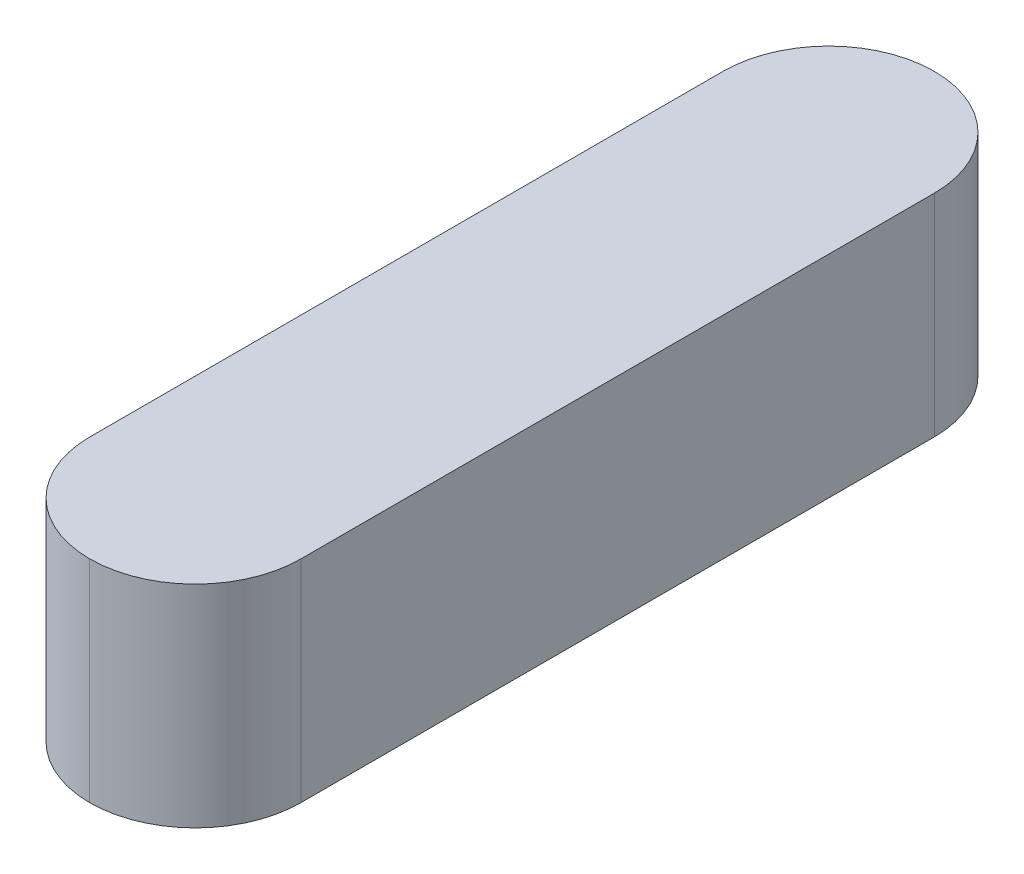
ISO-10303-21;
HEADER;
FILE_DESCRIPTION(('STEP AP214'),'2;1');
FILE_NAME('part.step','',(''),(''),'','','');
FILE_SCHEMA(('AUTOMOTIVE_DESIGN { 1 0 10303 214 1 1 1 1 }'));
ENDSEC;
DATA;
#1=APPLICATION_CONTEXT('core data for automotive mechanical design processes');
#2=APPLICATION_PROTOCOL_DEFINITION('international standard','automotive_design',2000,#1);
#3=PRODUCT_CONTEXT('',#1,'mechanical');
#4=PRODUCT('Part','Part','',(#3));
#5=PRODUCT_RELATED_PRODUCT_CATEGORY('part','',(#4));
#6=PRODUCT_DEFINITION_FORMATION('','',#4);
#7=PRODUCT_DEFINITION_CONTEXT('part definition',#1,'design');
#8=PRODUCT_DEFINITION('design','',#6,#7);
#9=PRODUCT_DEFINITION_SHAPE('','',#8);
#10=(LENGTH_UNIT() NAMED_UNIT(*) SI_UNIT(.MILLI.,.METRE.));
#11=(NAMED_UNIT(*) PLANE_ANGLE_UNIT() SI_UNIT($,.RADIAN.));
#12=(NAMED_UNIT(*) SI_UNIT($,.STERADIAN.) SOLID_ANGLE_UNIT());
#13=UNCERTAINTY_MEASURE_WITH_UNIT(LENGTH_MEASURE(1.E-05),#10,'distance_accuracy_value','');
#14=(GEOMETRIC_REPRESENTATION_CONTEXT(3) GLOBAL_UNCERTAINTY_ASSIGNED_CONTEXT((#13)) GLOBAL_UNIT_ASSIGNED_CONTEXT((#10,
#11,#12)) REPRESENTATION_CONTEXT('',''));
#15=CARTESIAN_POINT('',(0.,0.,0.));
#16=DIRECTION('',(0.,0.,1.));
#17=DIRECTION('',(1.,0.,0.));
#18=AXIS2_PLACEMENT_3D('',#15,#16,#17);
#19=CARTESIAN_POINT('',(0.,0.,16.));
#20=DIRECTION('',(1.,0.,0.));
#21=DIRECTION('',(0.,1.,0.));
#22=AXIS2_PLACEMENT_3D('',#19,#20,#21);
#23=PLANE('',#22);
#24=DIRECTION('',(0.,0.,-1.));
#25=VECTOR('',#24,1.);
#26=CARTESIAN_POINT('',(0.,4.,16.));
#27=LINE('',#26,#25);
#28=CARTESIAN_POINT('',(0.,4.,14.));
#29=VERTEX_POINT('',#28);
#30=CARTESIAN_POINT('',(0.,4.,2.));
#31=VERTEX_POINT('',#30);
#32=EDGE_CURVE('E127',#29,#31,#27,.T.);
#33=ORIENTED_EDGE('',*,*,#32,.T.);
#34=DIRECTION('',(0.,-1.,0.));
#35=VECTOR('',#34,1.);
#36=CARTESIAN_POINT('',(0.,0.,2.));
#37=LINE('',#36,#35);
#38=CARTESIAN_POINT('',(0.,0.,2.));
#39=VERTEX_POINT('',#38);
#40=EDGE_CURVE('E106',#31,#39,#37,.T.);
#41=ORIENTED_EDGE('',*,*,#40,.T.);
#42=DIRECTION('',(0.,0.,-1.));
#43=VECTOR('',#42,1.);
#44=CARTESIAN_POINT('',(0.,0.,16.));
#45=LINE('',#44,#43);
#46=CARTESIAN_POINT('',(0.,0.,14.));
#47=VERTEX_POINT('',#46);
#48=EDGE_CURVE('E89',#47,#39,#45,.T.);
#49=ORIENTED_EDGE('',*,*,#48,.F.);
#50=DIRECTION('',(0.,-1.,0.));
#51=VECTOR('',#50,1.);
#52=CARTESIAN_POINT('',(0.,0.,14.));
#53=LINE('',#52,#51);
#54=EDGE_CURVE('E103',#47,#29,#53,.F.);
#55=ORIENTED_EDGE('',*,*,#54,.T.);
#56=EDGE_LOOP('',(#33,#41,#49,#55));
#57=FACE_BOUND('',#56,.T.);
#58=ADVANCED_FACE('F32',(#57),#23,.F.);
#59=CARTESIAN_POINT('',(0.,0.,16.));
#60=DIRECTION('',(0.,1.,0.));
#61=DIRECTION('',(0.,0.,1.));
#62=AXIS2_PLACEMENT_3D('',#59,#60,#61);
#63=PLANE('',#62);
#64=ORIENTED_EDGE('',*,*,#48,.T.);
#65=CARTESIAN_POINT('',(2.,0.,2.));
#66=DIRECTION('',(0.,1.,0.));
#67=DIRECTION('',(0.,0.,1.));
#68=AXIS2_PLACEMENT_3D('',#65,#66,#67);
#69=CIRCLE('',#68,2.);
#70=CARTESIAN_POINT('',(2.,0.,0.));
#71=VERTEX_POINT('',#70);
#72=EDGE_CURVE('E117',#39,#71,#69,.F.);
#73=ORIENTED_EDGE('',*,*,#72,.T.);
#74=CARTESIAN_POINT('',(2.,0.,2.));
#75=DIRECTION('',(0.,1.,0.));
#76=DIRECTION('',(0.,0.,1.));
#77=AXIS2_PLACEMENT_3D('',#74,#75,#76);
#78=CIRCLE('',#77,2.);
#79=CARTESIAN_POINT('',(4.,0.,2.));
#80=VERTEX_POINT('',#79);
#81=EDGE_CURVE('E97',#71,#80,#78,.F.);
#82=ORIENTED_EDGE('',*,*,#81,.T.);
#83=DIRECTION('',(0.,0.,-1.));
#84=VECTOR('',#83,1.);
#85=CARTESIAN_POINT('',(4.,0.,16.));
#86=LINE('',#85,#84);
#87=CARTESIAN_POINT('',(4.,0.,14.));
#88=VERTEX_POINT('',#87);
#89=EDGE_CURVE('E107',#88,#80,#86,.T.);
#90=ORIENTED_EDGE('',*,*,#89,.F.);
#91=CARTESIAN_POINT('',(2.,0.,14.));
#92=DIRECTION('',(0.,1.,0.));
#93=DIRECTION('',(0.,0.,1.));
#94=AXIS2_PLACEMENT_3D('',#91,#92,#93);
#95=CIRCLE('',#94,2.);
#96=CARTESIAN_POINT('',(2.,0.,16.));
#97=VERTEX_POINT('',#96);
#98=EDGE_CURVE('E92',#88,#97,#95,.F.);
#99=ORIENTED_EDGE('',*,*,#98,.T.);
#100=CARTESIAN_POINT('',(2.,0.,14.));
#101=DIRECTION('',(0.,1.,0.));
#102=DIRECTION('',(0.,0.,1.));
#103=AXIS2_PLACEMENT_3D('',#100,#101,#102);
#104=CIRCLE('',#103,2.);
#105=EDGE_CURVE('E86',#97,#47,#104,.F.);
#106=ORIENTED_EDGE('',*,*,#105,.T.);
#107=EDGE_LOOP('',(#64,#73,#82,#90,#99,#106));
#108=FACE_BOUND('',#107,.T.);
#109=ADVANCED_FACE('F88',(#108),#63,.F.);
#110=CARTESIAN_POINT('',(4.,0.,16.));
#111=DIRECTION('',(-1.,0.,0.));
#112=DIRECTION('',(0.,-1.,0.));
#113=AXIS2_PLACEMENT_3D('',#110,#111,#112);
#114=PLANE('',#113);
#115=ORIENTED_EDGE('',*,*,#89,.T.);
#116=DIRECTION('',(0.,1.,0.));
#117=VECTOR('',#116,1.);
#118=CARTESIAN_POINT('',(4.,4.,2.));
#119=LINE('',#118,#117);
#120=CARTESIAN_POINT('',(4.,4.,2.));
#121=VERTEX_POINT('',#120);
#122=EDGE_CURVE('E11',#80,#121,#119,.T.);
#123=ORIENTED_EDGE('',*,*,#122,.T.);
#124=DIRECTION('',(0.,0.,-1.));
#125=VECTOR('',#124,1.);
#126=CARTESIAN_POINT('',(4.,4.,16.));
#127=LINE('',#126,#125);
#128=CARTESIAN_POINT('',(4.,4.,14.));
#129=VERTEX_POINT('',#128);
#130=EDGE_CURVE('E131',#129,#121,#127,.T.);
#131=ORIENTED_EDGE('',*,*,#130,.F.);
#132=DIRECTION('',(0.,1.,0.));
#133=VECTOR('',#132,1.);
#134=CARTESIAN_POINT('',(4.,0.,14.));
#135=LINE('',#134,#133);
#136=EDGE_CURVE('E41',#129,#88,#135,.F.);
#137=ORIENTED_EDGE('',*,*,#136,.T.);
#138=EDGE_LOOP('',(#115,#123,#131,#137));
#139=FACE_BOUND('',#138,.T.);
#140=ADVANCED_FACE('F135',(#139),#114,.F.);
#141=CARTESIAN_POINT('',(0.,4.,16.));
#142=DIRECTION('',(0.,-1.,0.));
#143=DIRECTION('',(0.,0.,-1.));
#144=AXIS2_PLACEMENT_3D('',#141,#142,#143);
#145=PLANE('',#144);
#146=CARTESIAN_POINT('',(2.,4.,2.));
#147=DIRECTION('',(0.,-1.,0.));
#148=DIRECTION('',(0.,0.,-1.));
#149=AXIS2_PLACEMENT_3D('',#146,#147,#148);
#150=CIRCLE('',#149,2.);
#151=CARTESIAN_POINT('',(2.,4.,0.));
#152=VERTEX_POINT('',#151);
#153=EDGE_CURVE('E121',#121,#152,#150,.F.);
#154=ORIENTED_EDGE('',*,*,#153,.T.);
#155=CARTESIAN_POINT('',(2.,4.,2.));
#156=DIRECTION('',(0.,-1.,0.));
#157=DIRECTION('',(0.,0.,-1.));
#158=AXIS2_PLACEMENT_3D('',#155,#156,#157);
#159=CIRCLE('',#158,2.);
#160=EDGE_CURVE('E123',#152,#31,#159,.F.);
#161=ORIENTED_EDGE('',*,*,#160,.T.);
#162=ORIENTED_EDGE('',*,*,#32,.F.);
#163=CARTESIAN_POINT('',(2.,4.,14.));
#164=DIRECTION('',(0.,-1.,0.));
#165=DIRECTION('',(0.,0.,-1.));
#166=AXIS2_PLACEMENT_3D('',#163,#164,#165);
#167=CIRCLE('',#166,2.);
#168=CARTESIAN_POINT('',(2.,4.,16.));
#169=VERTEX_POINT('',#168);
#170=EDGE_CURVE('E110',#29,#169,#167,.F.);
#171=ORIENTED_EDGE('',*,*,#170,.T.);
#172=CARTESIAN_POINT('',(2.,4.,14.));
#173=DIRECTION('',(0.,-1.,0.));
#174=DIRECTION('',(0.,0.,-1.));
#175=AXIS2_PLACEMENT_3D('',#172,#173,#174);
#176=CIRCLE('',#175,2.);
#177=EDGE_CURVE('E54',#169,#129,#176,.F.);
#178=ORIENTED_EDGE('',*,*,#177,.T.);
#179=ORIENTED_EDGE('',*,*,#130,.T.);
#180=EDGE_LOOP('',(#154,#161,#162,#171,#178,#179));
#181=FACE_BOUND('',#180,.T.);
#182=ADVANCED_FACE('F139',(#181),#145,.F.);
#183=CARTESIAN_POINT('',(2.,0.,2.));
#184=DIRECTION('',(0.,-1.,0.));
#185=DIRECTION('',(1.,0.,0.));
#186=AXIS2_PLACEMENT_3D('',#183,#184,#185);
#187=CYLINDRICAL_SURFACE('',#186,2.);
#188=DIRECTION('',(0.,1.,0.));
#189=VECTOR('',#188,1.);
#190=CARTESIAN_POINT('',(2.,0.,0.));
#191=LINE('',#190,#189);
#192=EDGE_CURVE('E125',#152,#71,#191,.F.);
#193=ORIENTED_EDGE('',*,*,#192,.F.);
#194=ORIENTED_EDGE('',*,*,#153,.F.);
#195=ORIENTED_EDGE('',*,*,#122,.F.);
#196=ORIENTED_EDGE('',*,*,#81,.F.);
#197=EDGE_LOOP('',(#193,#194,#195,#196));
#198=FACE_BOUND('',#197,.T.);
#199=ADVANCED_FACE('F141',(#198),#187,.T.);
#200=CARTESIAN_POINT('',(2.,0.,2.));
#201=DIRECTION('',(0.,1.,0.));
#202=DIRECTION('',(-1.,0.,0.));
#203=AXIS2_PLACEMENT_3D('',#200,#201,#202);
#204=CYLINDRICAL_SURFACE('',#203,2.);
#205=ORIENTED_EDGE('',*,*,#160,.F.);
#206=ORIENTED_EDGE('',*,*,#192,.T.);
#207=ORIENTED_EDGE('',*,*,#72,.F.);
#208=ORIENTED_EDGE('',*,*,#40,.F.);
#209=EDGE_LOOP('',(#205,#206,#207,#208));
#210=FACE_BOUND('',#209,.T.);
#211=ADVANCED_FACE('F142',(#210),#204,.T.);
#212=CARTESIAN_POINT('',(2.,4.,14.));
#213=DIRECTION('',(0.,1.,0.));
#214=DIRECTION('',(-1.,0.,0.));
#215=AXIS2_PLACEMENT_3D('',#212,#213,#214);
#216=CYLINDRICAL_SURFACE('',#215,2.);
#217=ORIENTED_EDGE('',*,*,#136,.F.);
#218=ORIENTED_EDGE('',*,*,#177,.F.);
#219=DIRECTION('',(0.,1.,0.));
#220=VECTOR('',#219,1.);
#221=CARTESIAN_POINT('',(2.,4.,16.));
#222=LINE('',#221,#220);
#223=EDGE_CURVE('E36',#97,#169,#222,.T.);
#224=ORIENTED_EDGE('',*,*,#223,.F.);
#225=ORIENTED_EDGE('',*,*,#98,.F.);
#226=EDGE_LOOP('',(#217,#218,#224,#225));
#227=FACE_BOUND('',#226,.T.);
#228=ADVANCED_FACE('F34',(#227),#216,.T.);
#229=CARTESIAN_POINT('',(2.,4.,14.));
#230=DIRECTION('',(0.,-1.,0.));
#231=DIRECTION('',(1.,0.,0.));
#232=AXIS2_PLACEMENT_3D('',#229,#230,#231);
#233=CYLINDRICAL_SURFACE('',#232,2.);
#234=ORIENTED_EDGE('',*,*,#170,.F.);
#235=ORIENTED_EDGE('',*,*,#54,.F.);
#236=ORIENTED_EDGE('',*,*,#105,.F.);
#237=ORIENTED_EDGE('',*,*,#223,.T.);
#238=EDGE_LOOP('',(#234,#235,#236,#237));
#239=FACE_BOUND('',#238,.T.);
#240=ADVANCED_FACE('F109',(#239),#233,.T.);
#241=CLOSED_SHELL('',(#58,#109,#140,#182,#199,#211,#228,#240));
#242=MANIFOLD_SOLID_BREP('B2',#241);
#243=ADVANCED_BREP_SHAPE_REPRESENTATION('',(#18,#242),#14);
#244=SHAPE_DEFINITION_REPRESENTATION(#9,#243);
ENDSEC;
END-ISO-10303-21;
